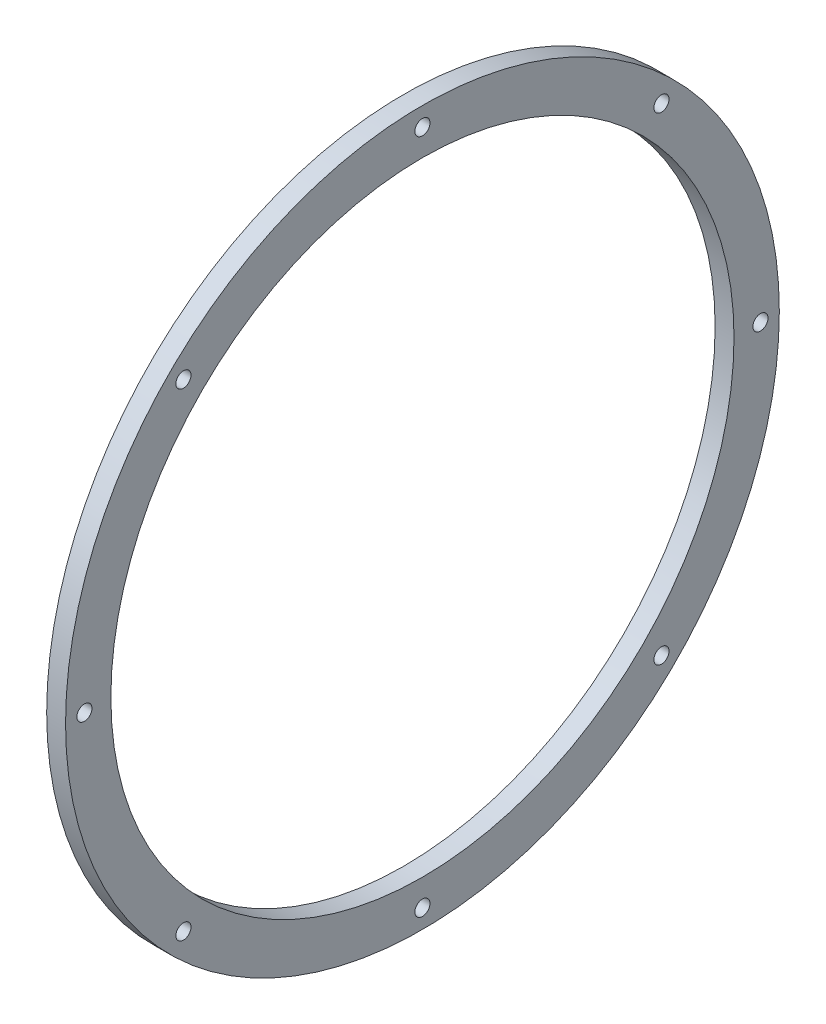
ISO-10303-21;
HEADER;
FILE_DESCRIPTION(('STEP AP214'),'2;1');
FILE_NAME('part.step','',(''),(''),'','','');
FILE_SCHEMA(('AUTOMOTIVE_DESIGN { 1 0 10303 214 1 1 1 1 }'));
ENDSEC;
DATA;
#1=APPLICATION_CONTEXT('core data for automotive mechanical design processes');
#2=APPLICATION_PROTOCOL_DEFINITION('international standard','automotive_design',2000,#1);
#3=PRODUCT_CONTEXT('',#1,'mechanical');
#4=PRODUCT('Part','Part','',(#3));
#5=PRODUCT_RELATED_PRODUCT_CATEGORY('part','',(#4));
#6=PRODUCT_DEFINITION_FORMATION('','',#4);
#7=PRODUCT_DEFINITION_CONTEXT('part definition',#1,'design');
#8=PRODUCT_DEFINITION('design','',#6,#7);
#9=PRODUCT_DEFINITION_SHAPE('','',#8);
#10=(LENGTH_UNIT() NAMED_UNIT(*) SI_UNIT(.MILLI.,.METRE.));
#11=(NAMED_UNIT(*) PLANE_ANGLE_UNIT() SI_UNIT($,.RADIAN.));
#12=(NAMED_UNIT(*) SI_UNIT($,.STERADIAN.) SOLID_ANGLE_UNIT());
#13=UNCERTAINTY_MEASURE_WITH_UNIT(LENGTH_MEASURE(1.E-05),#10,'distance_accuracy_value','');
#14=(GEOMETRIC_REPRESENTATION_CONTEXT(3) GLOBAL_UNCERTAINTY_ASSIGNED_CONTEXT((#13)) GLOBAL_UNIT_ASSIGNED_CONTEXT((#10,
#11,#12)) REPRESENTATION_CONTEXT('',''));
#15=CARTESIAN_POINT('',(0.,0.,0.));
#16=DIRECTION('',(0.,0.,1.));
#17=DIRECTION('',(1.,0.,0.));
#18=AXIS2_PLACEMENT_3D('',#15,#16,#17);
#19=CARTESIAN_POINT('',(-206.01793217917,0.,0.));
#20=DIRECTION('',(-1.,0.,0.));
#21=DIRECTION('',(0.,0.,1.));
#22=AXIS2_PLACEMENT_3D('',#19,#20,#21);
#23=CYLINDRICAL_SURFACE('',#22,82.5);
#24=CARTESIAN_POINT('',(-81.,0.,0.));
#25=DIRECTION('',(-1.,0.,0.));
#26=DIRECTION('',(0.,0.,1.));
#27=AXIS2_PLACEMENT_3D('',#24,#25,#26);
#28=CIRCLE('',#27,82.5);
#29=CARTESIAN_POINT('',(-81.,0.,82.5));
#30=VERTEX_POINT('',#29);
#31=EDGE_CURVE('E10',#30,#30,#28,.T.);
#32=ORIENTED_EDGE('',*,*,#31,.F.);
#33=EDGE_LOOP('',(#32));
#34=FACE_BOUND('',#33,.T.);
#35=CARTESIAN_POINT('',(-86.,0.,0.));
#36=DIRECTION('',(-1.,0.,0.));
#37=DIRECTION('',(0.,0.,1.));
#38=AXIS2_PLACEMENT_3D('',#35,#36,#37);
#39=CIRCLE('',#38,82.5);
#40=CARTESIAN_POINT('',(-86.,0.,82.5));
#41=VERTEX_POINT('',#40);
#42=EDGE_CURVE('E51',#41,#41,#39,.T.);
#43=ORIENTED_EDGE('',*,*,#42,.T.);
#44=EDGE_LOOP('',(#43));
#45=FACE_BOUND('',#44,.T.);
#46=ADVANCED_FACE('F37',(#34,#45),#23,.F.);
#47=CARTESIAN_POINT('',(-81.,0.,0.));
#48=DIRECTION('',(-1.,0.,0.));
#49=DIRECTION('',(0.,0.,1.));
#50=AXIS2_PLACEMENT_3D('',#47,#48,#49);
#51=PLANE('',#50);
#52=CARTESIAN_POINT('',(-81.,-3.1248757982646E-13,-89.5));
#53=DIRECTION('',(-1.,0.,0.));
#54=DIRECTION('',(0.,1.,0.));
#55=AXIS2_PLACEMENT_3D('',#52,#53,#54);
#56=CIRCLE('',#55,2.);
#57=CARTESIAN_POINT('',(-81.,1.99999999999969,-89.5));
#58=VERTEX_POINT('',#57);
#59=EDGE_CURVE('E68',#58,#58,#56,.T.);
#60=ORIENTED_EDGE('',*,*,#59,.T.);
#61=EDGE_LOOP('',(#60));
#62=FACE_BOUND('',#61,.T.);
#63=CARTESIAN_POINT('',(-81.,-63.2860569161963,-63.2860569161957));
#64=DIRECTION('',(-1.,0.,0.));
#65=DIRECTION('',(0.,0.707106781186544,-0.707106781186551));
#66=AXIS2_PLACEMENT_3D('',#63,#64,#65);
#67=CIRCLE('',#66,2.);
#68=CARTESIAN_POINT('',(-81.,-61.8718433538232,-64.7002704785688));
#69=VERTEX_POINT('',#68);
#70=EDGE_CURVE('E83',#69,#69,#67,.T.);
#71=ORIENTED_EDGE('',*,*,#70,.T.);
#72=EDGE_LOOP('',(#71));
#73=FACE_BOUND('',#72,.T.);
#74=CARTESIAN_POINT('',(-81.,-89.5,0.));
#75=DIRECTION('',(-1.,0.,0.));
#76=DIRECTION('',(0.,0.,-1.));
#77=AXIS2_PLACEMENT_3D('',#74,#75,#76);
#78=CIRCLE('',#77,2.);
#79=CARTESIAN_POINT('',(-81.,-89.5,-2.));
#80=VERTEX_POINT('',#79);
#81=EDGE_CURVE('E77',#80,#80,#78,.T.);
#82=ORIENTED_EDGE('',*,*,#81,.T.);
#83=EDGE_LOOP('',(#82));
#84=FACE_BOUND('',#83,.T.);
#85=CARTESIAN_POINT('',(-81.,-63.2860569161954,63.2860569161966));
#86=DIRECTION('',(-1.,0.,0.));
#87=DIRECTION('',(0.,-0.707106781186554,-0.707106781186541));
#88=AXIS2_PLACEMENT_3D('',#85,#86,#87);
#89=CIRCLE('',#88,2.);
#90=CARTESIAN_POINT('',(-81.,-64.7002704785686,61.8718433538235));
#91=VERTEX_POINT('',#90);
#92=EDGE_CURVE('E69',#91,#91,#89,.T.);
#93=ORIENTED_EDGE('',*,*,#92,.T.);
#94=EDGE_LOOP('',(#93));
#95=FACE_BOUND('',#94,.T.);
#96=CARTESIAN_POINT('',(-81.,9.37462739479381E-13,89.5));
#97=DIRECTION('',(-1.,0.,0.));
#98=DIRECTION('',(0.,-1.,0.));
#99=AXIS2_PLACEMENT_3D('',#96,#97,#98);
#100=CIRCLE('',#99,2.);
#101=CARTESIAN_POINT('',(-81.,-1.99999999999906,89.5));
#102=VERTEX_POINT('',#101);
#103=EDGE_CURVE('E76',#102,#102,#100,.T.);
#104=ORIENTED_EDGE('',*,*,#103,.T.);
#105=EDGE_LOOP('',(#104));
#106=FACE_BOUND('',#105,.T.);
#107=CARTESIAN_POINT('',(-81.,63.2860569161968,63.2860569161952));
#108=DIRECTION('',(-1.,0.,0.));
#109=DIRECTION('',(0.,-0.707106781186539,0.707106781186556));
#110=AXIS2_PLACEMENT_3D('',#107,#108,#109);
#111=CIRCLE('',#110,2.);
#112=CARTESIAN_POINT('',(-81.,61.8718433538237,64.7002704785683));
#113=VERTEX_POINT('',#112);
#114=EDGE_CURVE('E93',#113,#113,#111,.T.);
#115=ORIENTED_EDGE('',*,*,#114,.T.);
#116=EDGE_LOOP('',(#115));
#117=FACE_BOUND('',#116,.T.);
#118=CARTESIAN_POINT('',(-81.,63.2860569161959,-63.2860569161961));
#119=DIRECTION('',(-1.,0.,0.));
#120=DIRECTION('',(0.,0.707106781186549,0.707106781186546));
#121=AXIS2_PLACEMENT_3D('',#118,#119,#120);
#122=CIRCLE('',#121,2.);
#123=CARTESIAN_POINT('',(-81.,64.700270478569,-61.871843353823));
#124=VERTEX_POINT('',#123);
#125=EDGE_CURVE('E62',#124,#124,#122,.T.);
#126=ORIENTED_EDGE('',*,*,#125,.T.);
#127=EDGE_LOOP('',(#126));
#128=FACE_BOUND('',#127,.T.);
#129=CARTESIAN_POINT('',(-81.,89.5,0.));
#130=DIRECTION('',(-1.,0.,0.));
#131=DIRECTION('',(0.,0.,1.));
#132=AXIS2_PLACEMENT_3D('',#129,#130,#131);
#133=CIRCLE('',#132,2.);
#134=CARTESIAN_POINT('',(-81.,89.5,2.));
#135=VERTEX_POINT('',#134);
#136=EDGE_CURVE('E56',#135,#135,#133,.T.);
#137=ORIENTED_EDGE('',*,*,#136,.T.);
#138=EDGE_LOOP('',(#137));
#139=FACE_BOUND('',#138,.T.);
#140=CARTESIAN_POINT('',(-81.,0.,0.));
#141=DIRECTION('',(-1.,0.,0.));
#142=DIRECTION('',(0.,0.,1.));
#143=AXIS2_PLACEMENT_3D('',#140,#141,#142);
#144=CIRCLE('',#143,94.4999999999982);
#145=CARTESIAN_POINT('',(-81.,0.,94.4999999999982));
#146=VERTEX_POINT('',#145);
#147=EDGE_CURVE('E43',#146,#146,#144,.T.);
#148=ORIENTED_EDGE('',*,*,#147,.F.);
#149=EDGE_LOOP('',(#148));
#150=FACE_BOUND('',#149,.T.);
#151=ORIENTED_EDGE('',*,*,#31,.T.);
#152=EDGE_LOOP('',(#151));
#153=FACE_BOUND('',#152,.T.);
#154=ADVANCED_FACE('F126',(#62,#73,#84,#95,#106,#117,#128,#139,#150,#153),#51,.F.);
#155=CARTESIAN_POINT('',(-206.01793217917,0.,0.));
#156=DIRECTION('',(-1.,0.,0.));
#157=DIRECTION('',(0.,0.,1.));
#158=AXIS2_PLACEMENT_3D('',#155,#156,#157);
#159=CYLINDRICAL_SURFACE('',#158,94.4999999999982);
#160=ORIENTED_EDGE('',*,*,#147,.T.);
#161=EDGE_LOOP('',(#160));
#162=FACE_BOUND('',#161,.T.);
#163=CARTESIAN_POINT('',(-86.,0.,0.));
#164=DIRECTION('',(-1.,0.,0.));
#165=DIRECTION('',(0.,0.,1.));
#166=AXIS2_PLACEMENT_3D('',#163,#164,#165);
#167=CIRCLE('',#166,94.4999999999982);
#168=CARTESIAN_POINT('',(-86.,0.,94.4999999999982));
#169=VERTEX_POINT('',#168);
#170=EDGE_CURVE('E47',#169,#169,#167,.T.);
#171=ORIENTED_EDGE('',*,*,#170,.F.);
#172=EDGE_LOOP('',(#171));
#173=FACE_BOUND('',#172,.T.);
#174=ADVANCED_FACE('F112',(#162,#173),#159,.T.);
#175=CARTESIAN_POINT('',(-86.,0.,0.));
#176=DIRECTION('',(-1.,0.,0.));
#177=DIRECTION('',(0.,0.,1.));
#178=AXIS2_PLACEMENT_3D('',#175,#176,#177);
#179=PLANE('',#178);
#180=CARTESIAN_POINT('',(-86.,-3.1248757982646E-13,-89.5));
#181=DIRECTION('',(-1.,0.,0.));
#182=DIRECTION('',(0.,1.,0.));
#183=AXIS2_PLACEMENT_3D('',#180,#181,#182);
#184=CIRCLE('',#183,2.);
#185=CARTESIAN_POINT('',(-86.,1.99999999999969,-89.5));
#186=VERTEX_POINT('',#185);
#187=EDGE_CURVE('E86',#186,#186,#184,.T.);
#188=ORIENTED_EDGE('',*,*,#187,.F.);
#189=EDGE_LOOP('',(#188));
#190=FACE_BOUND('',#189,.T.);
#191=CARTESIAN_POINT('',(-86.,-63.2860569161963,-63.2860569161957));
#192=DIRECTION('',(-1.,0.,0.));
#193=DIRECTION('',(0.,0.707106781186544,-0.707106781186551));
#194=AXIS2_PLACEMENT_3D('',#191,#192,#193);
#195=CIRCLE('',#194,2.);
#196=CARTESIAN_POINT('',(-86.,-61.8718433538232,-64.7002704785688));
#197=VERTEX_POINT('',#196);
#198=EDGE_CURVE('E80',#197,#197,#195,.T.);
#199=ORIENTED_EDGE('',*,*,#198,.F.);
#200=EDGE_LOOP('',(#199));
#201=FACE_BOUND('',#200,.T.);
#202=CARTESIAN_POINT('',(-86.,-89.5,0.));
#203=DIRECTION('',(-1.,0.,0.));
#204=DIRECTION('',(0.,0.,-1.));
#205=AXIS2_PLACEMENT_3D('',#202,#203,#204);
#206=CIRCLE('',#205,2.);
#207=CARTESIAN_POINT('',(-86.,-89.5,-2.));
#208=VERTEX_POINT('',#207);
#209=EDGE_CURVE('E72',#208,#208,#206,.T.);
#210=ORIENTED_EDGE('',*,*,#209,.F.);
#211=EDGE_LOOP('',(#210));
#212=FACE_BOUND('',#211,.T.);
#213=CARTESIAN_POINT('',(-86.,-63.2860569161954,63.2860569161966));
#214=DIRECTION('',(-1.,0.,0.));
#215=DIRECTION('',(0.,-0.707106781186554,-0.707106781186541));
#216=AXIS2_PLACEMENT_3D('',#213,#214,#215);
#217=CIRCLE('',#216,2.);
#218=CARTESIAN_POINT('',(-86.,-64.7002704785686,61.8718433538235));
#219=VERTEX_POINT('',#218);
#220=EDGE_CURVE('E73',#219,#219,#217,.T.);
#221=ORIENTED_EDGE('',*,*,#220,.F.);
#222=EDGE_LOOP('',(#221));
#223=FACE_BOUND('',#222,.T.);
#224=CARTESIAN_POINT('',(-86.,9.37462739479381E-13,89.5));
#225=DIRECTION('',(-1.,0.,0.));
#226=DIRECTION('',(0.,-1.,0.));
#227=AXIS2_PLACEMENT_3D('',#224,#225,#226);
#228=CIRCLE('',#227,2.);
#229=CARTESIAN_POINT('',(-86.,-1.99999999999906,89.5));
#230=VERTEX_POINT('',#229);
#231=EDGE_CURVE('E96',#230,#230,#228,.T.);
#232=ORIENTED_EDGE('',*,*,#231,.F.);
#233=EDGE_LOOP('',(#232));
#234=FACE_BOUND('',#233,.T.);
#235=CARTESIAN_POINT('',(-86.,63.2860569161968,63.2860569161952));
#236=DIRECTION('',(-1.,0.,0.));
#237=DIRECTION('',(0.,-0.707106781186539,0.707106781186556));
#238=AXIS2_PLACEMENT_3D('',#235,#236,#237);
#239=CIRCLE('',#238,2.);
#240=CARTESIAN_POINT('',(-86.,61.8718433538237,64.7002704785683));
#241=VERTEX_POINT('',#240);
#242=EDGE_CURVE('E97',#241,#241,#239,.T.);
#243=ORIENTED_EDGE('',*,*,#242,.F.);
#244=EDGE_LOOP('',(#243));
#245=FACE_BOUND('',#244,.T.);
#246=CARTESIAN_POINT('',(-86.,63.2860569161959,-63.2860569161961));
#247=DIRECTION('',(-1.,0.,0.));
#248=DIRECTION('',(0.,0.707106781186549,0.707106781186546));
#249=AXIS2_PLACEMENT_3D('',#246,#247,#248);
#250=CIRCLE('',#249,2.);
#251=CARTESIAN_POINT('',(-86.,64.700270478569,-61.871843353823));
#252=VERTEX_POINT('',#251);
#253=EDGE_CURVE('E65',#252,#252,#250,.T.);
#254=ORIENTED_EDGE('',*,*,#253,.F.);
#255=EDGE_LOOP('',(#254));
#256=FACE_BOUND('',#255,.T.);
#257=CARTESIAN_POINT('',(-86.,89.5,0.));
#258=DIRECTION('',(-1.,0.,0.));
#259=DIRECTION('',(0.,0.,1.));
#260=AXIS2_PLACEMENT_3D('',#257,#258,#259);
#261=CIRCLE('',#260,2.);
#262=CARTESIAN_POINT('',(-86.,89.5,2.));
#263=VERTEX_POINT('',#262);
#264=EDGE_CURVE('E59',#263,#263,#261,.T.);
#265=ORIENTED_EDGE('',*,*,#264,.F.);
#266=EDGE_LOOP('',(#265));
#267=FACE_BOUND('',#266,.T.);
#268=ORIENTED_EDGE('',*,*,#170,.T.);
#269=EDGE_LOOP('',(#268));
#270=FACE_BOUND('',#269,.T.);
#271=ORIENTED_EDGE('',*,*,#42,.F.);
#272=EDGE_LOOP('',(#271));
#273=FACE_BOUND('',#272,.T.);
#274=ADVANCED_FACE('F108',(#190,#201,#212,#223,#234,#245,#256,#267,#270,#273),#179,.T.);
#275=CARTESIAN_POINT('',(-56.,89.5,0.));
#276=DIRECTION('',(-1.,0.,0.));
#277=DIRECTION('',(0.,0.,1.));
#278=AXIS2_PLACEMENT_3D('',#275,#276,#277);
#279=CYLINDRICAL_SURFACE('',#278,2.);
#280=ORIENTED_EDGE('',*,*,#264,.T.);
#281=EDGE_LOOP('',(#280));
#282=FACE_BOUND('',#281,.T.);
#283=ORIENTED_EDGE('',*,*,#136,.F.);
#284=EDGE_LOOP('',(#283));
#285=FACE_BOUND('',#284,.T.);
#286=ADVANCED_FACE('F111',(#282,#285),#279,.F.);
#287=CARTESIAN_POINT('',(-56.,63.2860569161959,-63.2860569161961));
#288=DIRECTION('',(-1.,0.,0.));
#289=DIRECTION('',(0.,0.707106781186549,0.707106781186546));
#290=AXIS2_PLACEMENT_3D('',#287,#288,#289);
#291=CYLINDRICAL_SURFACE('',#290,2.);
#292=ORIENTED_EDGE('',*,*,#253,.T.);
#293=EDGE_LOOP('',(#292));
#294=FACE_BOUND('',#293,.T.);
#295=ORIENTED_EDGE('',*,*,#125,.F.);
#296=EDGE_LOOP('',(#295));
#297=FACE_BOUND('',#296,.T.);
#298=ADVANCED_FACE('F140',(#294,#297),#291,.F.);
#299=CARTESIAN_POINT('',(-56.,63.2860569161968,63.2860569161952));
#300=DIRECTION('',(-1.,0.,0.));
#301=DIRECTION('',(0.,-0.707106781186539,0.707106781186556));
#302=AXIS2_PLACEMENT_3D('',#299,#300,#301);
#303=CYLINDRICAL_SURFACE('',#302,2.);
#304=ORIENTED_EDGE('',*,*,#242,.T.);
#305=EDGE_LOOP('',(#304));
#306=FACE_BOUND('',#305,.T.);
#307=ORIENTED_EDGE('',*,*,#114,.F.);
#308=EDGE_LOOP('',(#307));
#309=FACE_BOUND('',#308,.T.);
#310=ADVANCED_FACE('F144',(#306,#309),#303,.F.);
#311=CARTESIAN_POINT('',(-56.,9.37462739479381E-13,89.5));
#312=DIRECTION('',(-1.,0.,0.));
#313=DIRECTION('',(0.,-1.,0.));
#314=AXIS2_PLACEMENT_3D('',#311,#312,#313);
#315=CYLINDRICAL_SURFACE('',#314,2.);
#316=ORIENTED_EDGE('',*,*,#231,.T.);
#317=EDGE_LOOP('',(#316));
#318=FACE_BOUND('',#317,.T.);
#319=ORIENTED_EDGE('',*,*,#103,.F.);
#320=EDGE_LOOP('',(#319));
#321=FACE_BOUND('',#320,.T.);
#322=ADVANCED_FACE('F105',(#318,#321),#315,.F.);
#323=CARTESIAN_POINT('',(-56.,-63.2860569161954,63.2860569161966));
#324=DIRECTION('',(-1.,0.,0.));
#325=DIRECTION('',(0.,-0.707106781186554,-0.707106781186541));
#326=AXIS2_PLACEMENT_3D('',#323,#324,#325);
#327=CYLINDRICAL_SURFACE('',#326,2.);
#328=ORIENTED_EDGE('',*,*,#220,.T.);
#329=EDGE_LOOP('',(#328));
#330=FACE_BOUND('',#329,.T.);
#331=ORIENTED_EDGE('',*,*,#92,.F.);
#332=EDGE_LOOP('',(#331));
#333=FACE_BOUND('',#332,.T.);
#334=ADVANCED_FACE('F146',(#330,#333),#327,.F.);
#335=CARTESIAN_POINT('',(-56.,-89.5,0.));
#336=DIRECTION('',(-1.,0.,0.));
#337=DIRECTION('',(0.,0.,-1.));
#338=AXIS2_PLACEMENT_3D('',#335,#336,#337);
#339=CYLINDRICAL_SURFACE('',#338,2.);
#340=ORIENTED_EDGE('',*,*,#209,.T.);
#341=EDGE_LOOP('',(#340));
#342=FACE_BOUND('',#341,.T.);
#343=ORIENTED_EDGE('',*,*,#81,.F.);
#344=EDGE_LOOP('',(#343));
#345=FACE_BOUND('',#344,.T.);
#346=ADVANCED_FACE('F149',(#342,#345),#339,.F.);
#347=CARTESIAN_POINT('',(-56.,-63.2860569161963,-63.2860569161957));
#348=DIRECTION('',(-1.,0.,0.));
#349=DIRECTION('',(0.,0.707106781186544,-0.707106781186551));
#350=AXIS2_PLACEMENT_3D('',#347,#348,#349);
#351=CYLINDRICAL_SURFACE('',#350,2.);
#352=ORIENTED_EDGE('',*,*,#198,.T.);
#353=EDGE_LOOP('',(#352));
#354=FACE_BOUND('',#353,.T.);
#355=ORIENTED_EDGE('',*,*,#70,.F.);
#356=EDGE_LOOP('',(#355));
#357=FACE_BOUND('',#356,.T.);
#358=ADVANCED_FACE('F153',(#354,#357),#351,.F.);
#359=CARTESIAN_POINT('',(-56.,-3.1248757982646E-13,-89.5));
#360=DIRECTION('',(-1.,0.,0.));
#361=DIRECTION('',(0.,1.,0.));
#362=AXIS2_PLACEMENT_3D('',#359,#360,#361);
#363=CYLINDRICAL_SURFACE('',#362,2.);
#364=ORIENTED_EDGE('',*,*,#187,.T.);
#365=EDGE_LOOP('',(#364));
#366=FACE_BOUND('',#365,.T.);
#367=ORIENTED_EDGE('',*,*,#59,.F.);
#368=EDGE_LOOP('',(#367));
#369=FACE_BOUND('',#368,.T.);
#370=ADVANCED_FACE('F157',(#366,#369),#363,.F.);
#371=CLOSED_SHELL('',(#46,#154,#174,#274,#286,#298,#310,#322,#334,#346,#358,#370));
#372=MANIFOLD_SOLID_BREP('B2',#371);
#373=ADVANCED_BREP_SHAPE_REPRESENTATION('',(#18,#372),#14);
#374=SHAPE_DEFINITION_REPRESENTATION(#9,#373);
ENDSEC;
END-ISO-10303-21;
